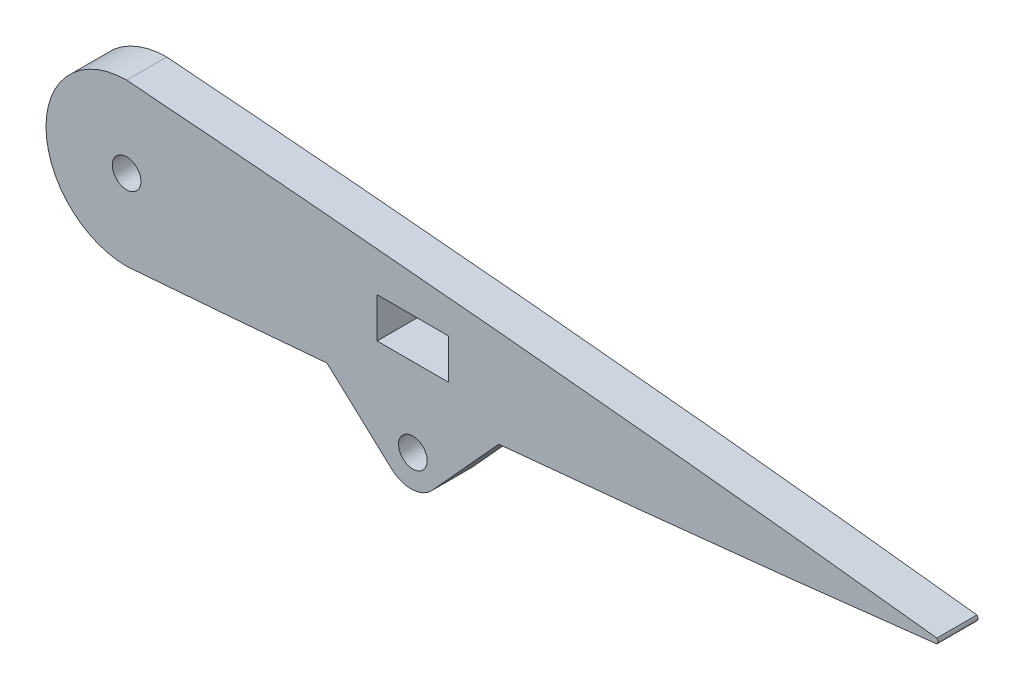
ISO-10303-21;
HEADER;
FILE_DESCRIPTION(('STEP AP214'),'2;1');
FILE_NAME('part.step','',(''),(''),'','','');
FILE_SCHEMA(('AUTOMOTIVE_DESIGN { 1 0 10303 214 1 1 1 1 }'));
ENDSEC;
DATA;
#1=APPLICATION_CONTEXT('core data for automotive mechanical design processes');
#2=APPLICATION_PROTOCOL_DEFINITION('international standard','automotive_design',2000,#1);
#3=PRODUCT_CONTEXT('',#1,'mechanical');
#4=PRODUCT('Part','Part','',(#3));
#5=PRODUCT_RELATED_PRODUCT_CATEGORY('part','',(#4));
#6=PRODUCT_DEFINITION_FORMATION('','',#4);
#7=PRODUCT_DEFINITION_CONTEXT('part definition',#1,'design');
#8=PRODUCT_DEFINITION('design','',#6,#7);
#9=PRODUCT_DEFINITION_SHAPE('','',#8);
#10=(LENGTH_UNIT() NAMED_UNIT(*) SI_UNIT(.MILLI.,.METRE.));
#11=(NAMED_UNIT(*) PLANE_ANGLE_UNIT() SI_UNIT($,.RADIAN.));
#12=(NAMED_UNIT(*) SI_UNIT($,.STERADIAN.) SOLID_ANGLE_UNIT());
#13=UNCERTAINTY_MEASURE_WITH_UNIT(LENGTH_MEASURE(1.E-05),#10,'distance_accuracy_value','');
#14=(GEOMETRIC_REPRESENTATION_CONTEXT(3) GLOBAL_UNCERTAINTY_ASSIGNED_CONTEXT((#13)) GLOBAL_UNIT_ASSIGNED_CONTEXT((#10,
#11,#12)) REPRESENTATION_CONTEXT('',''));
#15=CARTESIAN_POINT('',(0.,0.,0.));
#16=DIRECTION('',(0.,0.,1.));
#17=DIRECTION('',(1.,0.,0.));
#18=AXIS2_PLACEMENT_3D('',#15,#16,#17);
#19=CARTESIAN_POINT('',(138.229779125758,-125.665880118225,1.4));
#20=DIRECTION('',(-0.739933560222469,0.67267995841745,0.));
#21=DIRECTION('',(-0.67267995841745,-0.739933560222469,0.));
#22=AXIS2_PLACEMENT_3D('',#19,#20,#21);
#23=PLANE('',#22);
#24=DIRECTION('',(0.67267995841745,0.739933560222469,0.));
#25=VECTOR('',#24,1.);
#26=CARTESIAN_POINT('',(138.229779125758,-125.665880118225,-1.4));
#27=LINE('',#26,#25);
#28=CARTESIAN_POINT('',(244.735097220453,-8.51230921976116,-1.4));
#29=VERTEX_POINT('',#28);
#30=CARTESIAN_POINT('',(249.382624747265,-3.40012838827626,-1.4));
#31=VERTEX_POINT('',#30);
#32=EDGE_CURVE('E196',#29,#31,#27,.T.);
#33=ORIENTED_EDGE('',*,*,#32,.T.);
#34=DIRECTION('',(0.,0.,-1.));
#35=VECTOR('',#34,1.);
#36=CARTESIAN_POINT('',(249.382624747265,-3.40012838827626,1.4));
#37=LINE('',#36,#35);
#38=CARTESIAN_POINT('',(249.382624747265,-3.40012838827626,1.4));
#39=VERTEX_POINT('',#38);
#40=EDGE_CURVE('E11',#39,#31,#37,.T.);
#41=ORIENTED_EDGE('',*,*,#40,.F.);
#42=DIRECTION('',(0.67267995841745,0.739933560222469,0.));
#43=VECTOR('',#42,1.);
#44=CARTESIAN_POINT('',(138.229779125758,-125.665880118225,1.4));
#45=LINE('',#44,#43);
#46=CARTESIAN_POINT('',(244.735097220453,-8.51230921976116,1.4));
#47=VERTEX_POINT('',#46);
#48=EDGE_CURVE('E296',#47,#39,#45,.T.);
#49=ORIENTED_EDGE('',*,*,#48,.F.);
#50=DIRECTION('',(0.,0.,-1.));
#51=VECTOR('',#50,1.);
#52=CARTESIAN_POINT('',(244.735097220453,-8.51230921976116,1.4));
#53=LINE('',#52,#51);
#54=EDGE_CURVE('E236',#47,#29,#53,.T.);
#55=ORIENTED_EDGE('',*,*,#54,.T.);
#56=EDGE_LOOP('',(#33,#41,#49,#55));
#57=FACE_BOUND('',#56,.T.);
#58=ADVANCED_FACE('F41',(#57),#23,.F.);
#59=CARTESIAN_POINT('',(249.382624747265,-3.40012838827632,1.4));
#60=CARTESIAN_POINT('',(251.158571989076,-3.23227422422827,1.4));
#61=CARTESIAN_POINT('',(254.371192488481,-2.92300016112608,1.4));
#62=CARTESIAN_POINT('',(258.952644661841,-2.46718813767968,1.4));
#63=CARTESIAN_POINT('',(263.04774337821,-2.04785660382374,1.4));
#64=CARTESIAN_POINT('',(266.898988861822,-1.64260730408502,1.4));
#65=CARTESIAN_POINT('',(270.455833183166,-1.25859090465163,1.4));
#66=CARTESIAN_POINT('',(273.651166983566,-0.905304265448741,1.4));
#67=CARTESIAN_POINT('',(276.385426802208,-0.596436481930152,1.4));
#68=CARTESIAN_POINT('',(278.452596210233,-0.358958360841393,1.4));
#69=CARTESIAN_POINT('',(279.592043703671,-0.226075897782657,1.4));
#70=CARTESIAN_POINT('',(280.,-0.1785,1.4));
#71=B_SPLINE_CURVE_WITH_KNOTS('',3,(#59,#60,#61,#62,#63,#64,#65,#66,#67,#68,#69,#70),
.UNSPECIFIED.,.F.,.F.,(4,1,1,1,1,1,1,1,1,4),(0.821480843588143,0.852512114582347,
0.877624445997917,0.901571133904992,0.924121062493777,0.944988816236938,0.963803938777258,
0.980044339265455,0.992855276358985,1.),.UNSPECIFIED.);
#72=DIRECTION('',(0.,0.,-1.));
#73=VECTOR('',#72,1.);
#74=SURFACE_OF_LINEAR_EXTRUSION('',#71,#73);
#75=CARTESIAN_POINT('',(249.382624747265,-3.40012838827632,-1.4));
#76=CARTESIAN_POINT('',(251.158571989076,-3.23227422422827,-1.4));
#77=CARTESIAN_POINT('',(254.371192488481,-2.92300016112608,-1.4));
#78=CARTESIAN_POINT('',(258.952644661841,-2.46718813767968,-1.4));
#79=CARTESIAN_POINT('',(263.04774337821,-2.04785660382374,-1.4));
#80=CARTESIAN_POINT('',(266.898988861822,-1.64260730408502,-1.4));
#81=CARTESIAN_POINT('',(270.455833183166,-1.25859090465163,-1.4));
#82=CARTESIAN_POINT('',(273.651166983566,-0.905304265448741,-1.4));
#83=CARTESIAN_POINT('',(276.385426802208,-0.596436481930152,-1.4));
#84=CARTESIAN_POINT('',(278.452596210233,-0.358958360841393,-1.4));
#85=CARTESIAN_POINT('',(279.592043703671,-0.226075897782657,-1.4));
#86=CARTESIAN_POINT('',(280.,-0.1785,-1.4));
#87=B_SPLINE_CURVE_WITH_KNOTS('',3,(#75,#76,#77,#78,#79,#80,#81,#82,#83,#84,#85,#86),
.UNSPECIFIED.,.F.,.F.,(4,1,1,1,1,1,1,1,1,4),(0.821480843588143,0.852512114582347,
0.877624445997917,0.901571133904992,0.924121062493777,0.944988816236938,0.963803938777258,
0.980044339265455,0.992855276358985,1.),.UNSPECIFIED.);
#88=CARTESIAN_POINT('',(280.,-0.1785,-1.4));
#89=VERTEX_POINT('',#88);
#90=EDGE_CURVE('E200',#31,#89,#87,.T.);
#91=ORIENTED_EDGE('',*,*,#90,.T.);
#92=DIRECTION('',(0.,0.,-1.));
#93=VECTOR('',#92,1.);
#94=CARTESIAN_POINT('',(280.,-0.1785,1.4));
#95=LINE('',#94,#93);
#96=CARTESIAN_POINT('',(280.,-0.1785,1.4));
#97=VERTEX_POINT('',#96);
#98=EDGE_CURVE('E52',#97,#89,#95,.T.);
#99=ORIENTED_EDGE('',*,*,#98,.F.);
#100=EDGE_CURVE('E299',#39,#97,#71,.T.);
#101=ORIENTED_EDGE('',*,*,#100,.F.);
#102=ORIENTED_EDGE('',*,*,#40,.T.);
#103=EDGE_LOOP('',(#91,#99,#101,#102));
#104=FACE_BOUND('',#103,.T.);
#105=ADVANCED_FACE('F311',(#104),#74,.F.);
#106=CARTESIAN_POINT('',(279.8215,0.,1.4));
#107=DIRECTION('',(0.,0.,-1.));
#108=DIRECTION('',(-1.,0.,0.));
#109=AXIS2_PLACEMENT_3D('',#106,#107,#108);
#110=CYLINDRICAL_SURFACE('',#109,0.252437120883675);
#111=CARTESIAN_POINT('',(279.8215,0.,-1.4));
#112=DIRECTION('',(0.,0.,1.));
#113=DIRECTION('',(1.,0.,0.));
#114=AXIS2_PLACEMENT_3D('',#111,#112,#113);
#115=CIRCLE('',#114,0.252437120883675);
#116=CARTESIAN_POINT('',(280.,0.1785,-1.4));
#117=VERTEX_POINT('',#116);
#118=EDGE_CURVE('E206',#117,#89,#115,.F.);
#119=ORIENTED_EDGE('',*,*,#118,.F.);
#120=DIRECTION('',(0.,0.,-1.));
#121=VECTOR('',#120,1.);
#122=CARTESIAN_POINT('',(280.,0.1785,1.4));
#123=LINE('',#122,#121);
#124=CARTESIAN_POINT('',(280.,0.1785,1.4));
#125=VERTEX_POINT('',#124);
#126=EDGE_CURVE('E247',#125,#117,#123,.T.);
#127=ORIENTED_EDGE('',*,*,#126,.F.);
#128=CARTESIAN_POINT('',(279.8215,0.,1.4));
#129=DIRECTION('',(0.,0.,1.));
#130=DIRECTION('',(1.,0.,0.));
#131=AXIS2_PLACEMENT_3D('',#128,#129,#130);
#132=CIRCLE('',#131,0.252437120883675);
#133=EDGE_CURVE('E305',#125,#97,#132,.F.);
#134=ORIENTED_EDGE('',*,*,#133,.T.);
#135=ORIENTED_EDGE('',*,*,#98,.T.);
#136=EDGE_LOOP('',(#119,#127,#134,#135));
#137=FACE_BOUND('',#136,.T.);
#138=ADVANCED_FACE('F315',(#137),#110,.T.);
#139=CARTESIAN_POINT('',(280.,0.1785,1.4));
#140=CARTESIAN_POINT('',(279.592043703671,0.226075897783467,1.4));
#141=CARTESIAN_POINT('',(278.452596210234,0.358958360844463,1.4));
#142=CARTESIAN_POINT('',(276.385426802208,0.596436481937331,1.4));
#143=CARTESIAN_POINT('',(273.651166983567,0.905304265461348,1.4));
#144=CARTESIAN_POINT('',(270.455833183168,1.25859090467058,1.4));
#145=CARTESIAN_POINT('',(266.898988861825,1.64260730411104,1.4));
#146=CARTESIAN_POINT('',(263.047743378214,2.04785660385741,1.4));
#147=CARTESIAN_POINT('',(258.952644661846,2.46718813772148,1.4));
#148=CARTESIAN_POINT('',(253.11611192075,3.04786904369115,1.4));
#149=CARTESIAN_POINT('',(247.071089235748,3.62220530992837,1.4));
#150=CARTESIAN_POINT('',(240.854179313273,4.18491264898859,1.4));
#151=CARTESIAN_POINT('',(236.038226964104,4.60581174883637,1.4));
#152=CARTESIAN_POINT('',(231.150377302514,5.0173511026198,1.4));
#153=CARTESIAN_POINT('',(226.209311113549,5.41695826474113,1.4));
#154=CARTESIAN_POINT('',(221.232257466585,5.802244474926,1.4));
#155=CARTESIAN_POINT('',(216.235178286272,6.17086457697306,1.4));
#156=CARTESIAN_POINT('',(211.232977593233,6.52047434958791,1.4));
#157=CARTESIAN_POINT('',(206.239642946259,6.84887299963153,1.4));
#158=CARTESIAN_POINT('',(201.268368916985,7.15382688632495,1.4));
#159=CARTESIAN_POINT('',(196.331634567492,7.43310533690328,1.4));
#160=CARTESIAN_POINT('',(191.441311474098,7.68460443906704,1.4));
#161=CARTESIAN_POINT('',(186.608700126931,7.90621829286941,1.4));
#162=CARTESIAN_POINT('',(181.844626933159,8.09595849303594,1.4));
#163=CARTESIAN_POINT('',(177.159453511195,8.25195768192942,1.4));
#164=CARTESIAN_POINT('',(172.563150271755,8.37248656398387,1.4));
#165=CARTESIAN_POINT('',(168.065295924147,8.45595366245417,1.4));
#166=CARTESIAN_POINT('',(163.675147454163,8.5010026998616,1.4));
#167=CARTESIAN_POINT('',(159.401643403725,8.50652296727326,1.4));
#168=CARTESIAN_POINT('',(155.253439755899,8.47152880790102,1.4));
#169=CARTESIAN_POINT('',(151.238917925322,8.39550607585732,1.4));
#170=CARTESIAN_POINT('',(147.366223919106,8.27798597685019,1.4));
#171=CARTESIAN_POINT('',(143.643266298458,8.11897556141504,1.4));
#172=CARTESIAN_POINT('',(140.077743555427,7.91867894287145,1.4));
#173=CARTESIAN_POINT('',(136.677139412155,7.67760454203032,1.4));
#174=CARTESIAN_POINT('',(133.44876289533,7.39648056861162,1.4));
#175=CARTESIAN_POINT('',(130.399721685833,7.07642431038863,1.4));
#176=CARTESIAN_POINT('',(127.536961088608,6.71865034112428,1.4));
#177=CARTESIAN_POINT('',(124.867245825052,6.32466607739586,1.4));
#178=CARTESIAN_POINT('',(122.397158973637,5.89612056643678,1.4));
#179=CARTESIAN_POINT('',(120.133109351335,5.43479747619412,1.4));
#180=CARTESIAN_POINT('',(118.081312132678,4.94256764101073,1.4));
#181=CARTESIAN_POINT('',(116.247665797811,4.42139238611828,1.4));
#182=CARTESIAN_POINT('',(114.637939719778,3.87306046577258,1.4));
#183=CARTESIAN_POINT('',(113.256788366372,3.29930923783808,1.4));
#184=CARTESIAN_POINT('',(112.109835923497,2.70130638754162,1.4));
#185=CARTESIAN_POINT('',(111.196336340545,2.07855523302877,1.4));
#186=CARTESIAN_POINT('',(110.530223641577,1.42706975809109,1.4));
#187=CARTESIAN_POINT('',(110.085538217979,0.734230220465984,1.4));
#188=CARTESIAN_POINT('',(110.027578175867,0.236721440142773,1.4));
#189=CARTESIAN_POINT('',(110.,0.,1.4));
#190=B_SPLINE_CURVE_WITH_KNOTS('',3,(#139,#140,#141,#142,#143,#144,#145,#146,#147,#148,#149,
#150,#151,#152,#153,#154,#155,#156,#157,#158,#159,#160,#161,#162,#163,#164,#165,#166,#167,#168,
#169,#170,#171,#172,#173,#174,#175,#176,#177,#178,#179,#180,#181,#182,#183,#184,#185,#186,#187,
#188,#189),.UNSPECIFIED.,.F.,.F.,(4,1,1,1,1,1,1,1,1,1,1,1,1,1,1,1,1,1,1,1,1,1,1,1,1,1,1,1,1,1,1,
1,1,1,1,1,1,1,1,1,1,1,1,1,1,1,1,1,4),(0.,0.00714472364101537,0.0199556607345446,
0.0361960612227423,0.0550111837630616,0.0758789375062231,0.0984288660950085,0.122375554002083,
0.147487885417653,0.200459747132314,0.228005170188377,0.256076453638138,0.284555151070125,
0.31333276259982,0.342309553949656,0.371392651251454,0.400495752426115,0.429537687145242,
0.458441905920554,0.487136113386761,0.515551917136779,0.543623846405843,0.571289984327897,
0.598490809568145,0.625169613225281,0.651272029103837,0.676746157949116,0.701541790883913,
0.725611016556625,0.74890783507394,0.771387785068823,0.793008138575143,0.813728032856974,
0.833507815357633,0.852309696093785,0.870097310144046,0.886835918069106,0.902492781713446,
0.917037139140432,0.930441053860646,0.942679762162792,0.953733567025024,0.963589785484808,
0.97224701929817,0.979722225388436,0.986065145275041,0.991385258303778,0.995900988803729,1.),.UNSPECIFIED.);
#191=DIRECTION('',(0.,0.,-1.));
#192=VECTOR('',#191,1.);
#193=SURFACE_OF_LINEAR_EXTRUSION('',#190,#192);
#194=CARTESIAN_POINT('',(280.,0.1785,-1.4));
#195=CARTESIAN_POINT('',(279.592043703671,0.226075897783467,-1.4));
#196=CARTESIAN_POINT('',(278.452596210234,0.358958360844463,-1.4));
#197=CARTESIAN_POINT('',(276.385426802208,0.596436481937331,-1.4));
#198=CARTESIAN_POINT('',(273.651166983567,0.905304265461348,-1.4));
#199=CARTESIAN_POINT('',(270.455833183168,1.25859090467058,-1.4));
#200=CARTESIAN_POINT('',(266.898988861825,1.64260730411104,-1.4));
#201=CARTESIAN_POINT('',(263.047743378214,2.04785660385741,-1.4));
#202=CARTESIAN_POINT('',(258.952644661846,2.46718813772148,-1.4));
#203=CARTESIAN_POINT('',(253.11611192075,3.04786904369115,-1.4));
#204=CARTESIAN_POINT('',(247.071089235748,3.62220530992837,-1.4));
#205=CARTESIAN_POINT('',(240.854179313273,4.18491264898859,-1.4));
#206=CARTESIAN_POINT('',(236.038226964104,4.60581174883637,-1.4));
#207=CARTESIAN_POINT('',(231.150377302514,5.0173511026198,-1.4));
#208=CARTESIAN_POINT('',(226.209311113549,5.41695826474113,-1.4));
#209=CARTESIAN_POINT('',(221.232257466585,5.802244474926,-1.4));
#210=CARTESIAN_POINT('',(216.235178286272,6.17086457697306,-1.4));
#211=CARTESIAN_POINT('',(211.232977593233,6.52047434958791,-1.4));
#212=CARTESIAN_POINT('',(206.239642946259,6.84887299963153,-1.4));
#213=CARTESIAN_POINT('',(201.268368916985,7.15382688632495,-1.4));
#214=CARTESIAN_POINT('',(196.331634567492,7.43310533690328,-1.4));
#215=CARTESIAN_POINT('',(191.441311474098,7.68460443906704,-1.4));
#216=CARTESIAN_POINT('',(186.608700126931,7.90621829286941,-1.4));
#217=CARTESIAN_POINT('',(181.844626933159,8.09595849303594,-1.4));
#218=CARTESIAN_POINT('',(177.159453511195,8.25195768192942,-1.4));
#219=CARTESIAN_POINT('',(172.563150271755,8.37248656398387,-1.4));
#220=CARTESIAN_POINT('',(168.065295924147,8.45595366245417,-1.4));
#221=CARTESIAN_POINT('',(163.675147454163,8.5010026998616,-1.4));
#222=CARTESIAN_POINT('',(159.401643403725,8.50652296727326,-1.4));
#223=CARTESIAN_POINT('',(155.253439755899,8.47152880790102,-1.4));
#224=CARTESIAN_POINT('',(151.238917925322,8.39550607585732,-1.4));
#225=CARTESIAN_POINT('',(147.366223919106,8.27798597685019,-1.4));
#226=CARTESIAN_POINT('',(143.643266298458,8.11897556141504,-1.4));
#227=CARTESIAN_POINT('',(140.077743555427,7.91867894287145,-1.4));
#228=CARTESIAN_POINT('',(136.677139412155,7.67760454203032,-1.4));
#229=CARTESIAN_POINT('',(133.44876289533,7.39648056861162,-1.4));
#230=CARTESIAN_POINT('',(130.399721685833,7.07642431038863,-1.4));
#231=CARTESIAN_POINT('',(127.536961088608,6.71865034112428,-1.4));
#232=CARTESIAN_POINT('',(124.867245825052,6.32466607739586,-1.4));
#233=CARTESIAN_POINT('',(122.397158973637,5.89612056643678,-1.4));
#234=CARTESIAN_POINT('',(120.133109351335,5.43479747619412,-1.4));
#235=CARTESIAN_POINT('',(118.081312132678,4.94256764101073,-1.4));
#236=CARTESIAN_POINT('',(116.247665797811,4.42139238611828,-1.4));
#237=CARTESIAN_POINT('',(114.637939719778,3.87306046577258,-1.4));
#238=CARTESIAN_POINT('',(113.256788366372,3.29930923783808,-1.4));
#239=CARTESIAN_POINT('',(112.109835923497,2.70130638754162,-1.4));
#240=CARTESIAN_POINT('',(111.196336340545,2.07855523302877,-1.4));
#241=CARTESIAN_POINT('',(110.530223641577,1.42706975809109,-1.4));
#242=CARTESIAN_POINT('',(110.085538217979,0.734230220465984,-1.4));
#243=CARTESIAN_POINT('',(110.027578175867,0.236721440142773,-1.4));
#244=CARTESIAN_POINT('',(110.,0.,-1.4));
#245=B_SPLINE_CURVE_WITH_KNOTS('',3,(#194,#195,#196,#197,#198,#199,#200,#201,#202,#203,#204,
#205,#206,#207,#208,#209,#210,#211,#212,#213,#214,#215,#216,#217,#218,#219,#220,#221,#222,#223,
#224,#225,#226,#227,#228,#229,#230,#231,#232,#233,#234,#235,#236,#237,#238,#239,#240,#241,#242,
#243,#244),.UNSPECIFIED.,.F.,.F.,(4,1,1,1,1,1,1,1,1,1,1,1,1,1,1,1,1,1,1,1,1,1,1,1,1,1,1,1,1,1,1,
1,1,1,1,1,1,1,1,1,1,1,1,1,1,1,1,1,4),(0.,0.00714472364101537,0.0199556607345446,
0.0361960612227423,0.0550111837630616,0.0758789375062231,0.0984288660950085,0.122375554002083,
0.147487885417653,0.200459747132314,0.228005170188377,0.256076453638138,0.284555151070125,
0.31333276259982,0.342309553949656,0.371392651251454,0.400495752426115,0.429537687145242,
0.458441905920554,0.487136113386761,0.515551917136779,0.543623846405843,0.571289984327897,
0.598490809568145,0.625169613225281,0.651272029103837,0.676746157949116,0.701541790883913,
0.725611016556625,0.74890783507394,0.771387785068823,0.793008138575143,0.813728032856974,
0.833507815357633,0.852309696093785,0.870097310144046,0.886835918069106,0.902492781713446,
0.917037139140432,0.930441053860646,0.942679762162792,0.953733567025024,0.963589785484808,
0.97224701929817,0.979722225388436,0.986065145275041,0.991385258303778,0.995900988803729,1.),.UNSPECIFIED.);
#246=CARTESIAN_POINT('',(223.382624747256,5.63499062833055,-1.4));
#247=VERTEX_POINT('',#246);
#248=EDGE_CURVE('E213',#117,#247,#245,.T.);
#249=ORIENTED_EDGE('',*,*,#248,.T.);
#250=DIRECTION('',(0.,0.,-1.));
#251=VECTOR('',#250,1.);
#252=CARTESIAN_POINT('',(223.382624747256,5.63499062833055,1.4));
#253=LINE('',#252,#251);
#254=CARTESIAN_POINT('',(223.382624747256,5.63499062833055,1.4));
#255=VERTEX_POINT('',#254);
#256=EDGE_CURVE('E243',#255,#247,#253,.T.);
#257=ORIENTED_EDGE('',*,*,#256,.F.);
#258=EDGE_CURVE('E354',#125,#255,#190,.T.);
#259=ORIENTED_EDGE('',*,*,#258,.F.);
#260=ORIENTED_EDGE('',*,*,#126,.T.);
#261=EDGE_LOOP('',(#249,#257,#259,#260));
#262=FACE_BOUND('',#261,.T.);
#263=ADVANCED_FACE('F350',(#262),#193,.F.);
#264=CARTESIAN_POINT('',(223.382624747265,3.73832909072992E-12,1.4));
#265=DIRECTION('',(0.,0.,-1.));
#266=DIRECTION('',(-1.,0.,0.));
#267=AXIS2_PLACEMENT_3D('',#264,#265,#266);
#268=CYLINDRICAL_SURFACE('',#267,5.63499062832681);
#269=CARTESIAN_POINT('',(223.382624747265,3.73832909072992E-12,-1.4));
#270=DIRECTION('',(0.,0.,1.));
#271=DIRECTION('',(1.,0.,0.));
#272=AXIS2_PLACEMENT_3D('',#269,#270,#271);
#273=CIRCLE('',#272,5.63499062832681);
#274=CARTESIAN_POINT('',(223.382624747256,-5.63499062832307,-1.4));
#275=VERTEX_POINT('',#274);
#276=EDGE_CURVE('E218',#247,#275,#273,.T.);
#277=ORIENTED_EDGE('',*,*,#276,.T.);
#278=DIRECTION('',(0.,0.,-1.));
#279=VECTOR('',#278,1.);
#280=CARTESIAN_POINT('',(223.382624747256,-5.63499062832307,1.4));
#281=LINE('',#280,#279);
#282=CARTESIAN_POINT('',(223.382624747256,-5.63499062832307,1.4));
#283=VERTEX_POINT('',#282);
#284=EDGE_CURVE('E159',#283,#275,#281,.T.);
#285=ORIENTED_EDGE('',*,*,#284,.F.);
#286=CARTESIAN_POINT('',(223.382624747265,3.73832909072992E-12,1.4));
#287=DIRECTION('',(0.,0.,1.));
#288=DIRECTION('',(1.,0.,0.));
#289=AXIS2_PLACEMENT_3D('',#286,#287,#288);
#290=CIRCLE('',#289,5.63499062832681);
#291=EDGE_CURVE('E148',#255,#283,#290,.T.);
#292=ORIENTED_EDGE('',*,*,#291,.F.);
#293=ORIENTED_EDGE('',*,*,#256,.T.);
#294=EDGE_LOOP('',(#277,#285,#292,#293));
#295=FACE_BOUND('',#294,.T.);
#296=ADVANCED_FACE('F344',(#295),#268,.T.);
#297=CARTESIAN_POINT('',(110.,0.,1.4));
#298=CARTESIAN_POINT('',(110.0275781759,-0.23672144013897,1.4));
#299=CARTESIAN_POINT('',(110.08553821808,-0.734230220454186,1.4));
#300=CARTESIAN_POINT('',(110.530223641774,-1.42706975801802,1.4));
#301=CARTESIAN_POINT('',(111.196336340831,-2.07855523286391,1.4));
#302=CARTESIAN_POINT('',(112.109835923869,-2.70130638725085,1.4));
#303=CARTESIAN_POINT('',(113.256788366826,-3.29930923738926,1.4));
#304=CARTESIAN_POINT('',(114.637939720312,-3.87306046513341,1.4));
#305=CARTESIAN_POINT('',(116.24766579842,-4.42139238525728,1.4));
#306=CARTESIAN_POINT('',(118.081312133359,-4.94256763989703,1.4));
#307=CARTESIAN_POINT('',(120.133109352084,-5.43479747479766,1.4));
#308=CARTESIAN_POINT('',(122.39715897445,-5.8961205647283,1.4));
#309=CARTESIAN_POINT('',(124.867245825924,-6.32466607534698,1.4));
#310=CARTESIAN_POINT('',(127.536961089533,-6.71865033870748,1.4));
#311=CARTESIAN_POINT('',(130.399721686808,-7.07642430757731,1.4));
#312=CARTESIAN_POINT('',(133.44876289635,-7.3964805653801,1.4));
#313=CARTESIAN_POINT('',(136.677139413213,-7.6776045383539,1.4));
#314=CARTESIAN_POINT('',(140.077743556518,-7.91867893872639,1.4));
#315=CARTESIAN_POINT('',(143.643266299577,-8.1189755567786,1.4));
#316=CARTESIAN_POINT('',(147.366223920246,-8.27798597170068,1.4));
#317=CARTESIAN_POINT('',(151.238917926479,-8.39550607017411,1.4));
#318=CARTESIAN_POINT('',(155.253439757066,-8.47152880166456,1.4));
#319=CARTESIAN_POINT('',(159.401643404897,-8.50652296046512,1.4));
#320=CARTESIAN_POINT('',(163.675147455335,-8.50100269246453,1.4));
#321=CARTESIAN_POINT('',(168.065295925312,-8.45595365445208,1.4));
#322=CARTESIAN_POINT('',(172.563150272909,-8.37248655536192,1.4));
#323=CARTESIAN_POINT('',(177.159453512332,-8.25195767267405,1.4));
#324=CARTESIAN_POINT('',(181.844626934275,-8.0959584831349,1.4));
#325=CARTESIAN_POINT('',(186.60870012802,-7.90621828231182,1.4));
#326=CARTESIAN_POINT('',(191.441311475157,-7.68460442784347,1.4));
#327=CARTESIAN_POINT('',(196.331634568517,-7.43310532500576,1.4));
#328=CARTESIAN_POINT('',(201.268368917971,-7.15382687374709,1.4));
#329=CARTESIAN_POINT('',(206.239642947203,-6.84887298636857,1.4));
#330=CARTESIAN_POINT('',(211.232977594131,-6.52047433563681,1.4));
#331=CARTESIAN_POINT('',(216.235178287122,-6.17086456233259,1.4));
#332=CARTESIAN_POINT('',(221.232257467384,-5.80224445959688,1.4));
#333=CARTESIAN_POINT('',(226.209311114295,-5.41695824872611,1.4));
#334=CARTESIAN_POINT('',(231.150377303206,-5.01735108592385,1.4));
#335=CARTESIAN_POINT('',(234.870714804015,-4.70411205455705,1.4));
#336=CARTESIAN_POINT('',(236.942213239561,-4.52545946281774,1.4));
#337=CARTESIAN_POINT('',(237.382624747265,-4.48728584819188,1.4));
#338=B_SPLINE_CURVE_WITH_KNOTS('',3,(#297,#298,#299,#300,#301,#302,#303,#304,#305,#306,#307,
#308,#309,#310,#311,#312,#313,#314,#315,#316,#317,#318,#319,#320,#321,#322,#323,#324,#325,#326,
#327,#328,#329,#330,#331,#332,#333,#334,#335,#336,#337),.UNSPECIFIED.,.F.,.F.,(4,1,1,1,1,1,1,1,
1,1,1,1,1,1,1,1,1,1,1,1,1,1,1,1,1,1,1,1,1,1,1,1,1,1,1,1,1,1,4),(0.,0.00409901119627066,
0.00861474169622249,0.013934854724959,0.0202777746115639,0.0277529807018305,0.0364102145151919,
0.0462664329749759,0.057320237837208,0.0695589461393541,0.0829628608595683,0.0975072182865541,
0.113164081930894,0.129902689855954,0.147690303906216,0.166492184642367,0.186271967143026,
0.206991861424858,0.228612214931177,0.25109216492606,0.274388983443375,0.298458209116087,
0.323253842050884,0.348727970896163,0.374830386774719,0.401509190431855,0.428710015672103,
0.456376153594157,0.484448082863221,0.512863886613239,0.541558094079446,0.570462312854758,
0.599504247573885,0.628607348748546,0.657690446050344,0.68666723740018,0.715444848929875,
0.743923546361862,0.751613474270005),.UNSPECIFIED.);
#339=DIRECTION('',(0.,0.,-1.));
#340=VECTOR('',#339,1.);
#341=SURFACE_OF_LINEAR_EXTRUSION('',#338,#340);
#342=CARTESIAN_POINT('',(110.,0.,-1.4));
#343=CARTESIAN_POINT('',(110.0275781759,-0.23672144013897,-1.4));
#344=CARTESIAN_POINT('',(110.08553821808,-0.734230220454186,-1.4));
#345=CARTESIAN_POINT('',(110.530223641774,-1.42706975801802,-1.4));
#346=CARTESIAN_POINT('',(111.196336340831,-2.07855523286391,-1.4));
#347=CARTESIAN_POINT('',(112.109835923869,-2.70130638725085,-1.4));
#348=CARTESIAN_POINT('',(113.256788366826,-3.29930923738926,-1.4));
#349=CARTESIAN_POINT('',(114.637939720312,-3.87306046513341,-1.4));
#350=CARTESIAN_POINT('',(116.24766579842,-4.42139238525728,-1.4));
#351=CARTESIAN_POINT('',(118.081312133359,-4.94256763989703,-1.4));
#352=CARTESIAN_POINT('',(120.133109352084,-5.43479747479766,-1.4));
#353=CARTESIAN_POINT('',(122.39715897445,-5.8961205647283,-1.4));
#354=CARTESIAN_POINT('',(124.867245825924,-6.32466607534698,-1.4));
#355=CARTESIAN_POINT('',(127.536961089533,-6.71865033870748,-1.4));
#356=CARTESIAN_POINT('',(130.399721686808,-7.07642430757731,-1.4));
#357=CARTESIAN_POINT('',(133.44876289635,-7.3964805653801,-1.4));
#358=CARTESIAN_POINT('',(136.677139413213,-7.6776045383539,-1.4));
#359=CARTESIAN_POINT('',(140.077743556518,-7.91867893872639,-1.4));
#360=CARTESIAN_POINT('',(143.643266299577,-8.1189755567786,-1.4));
#361=CARTESIAN_POINT('',(147.366223920246,-8.27798597170068,-1.4));
#362=CARTESIAN_POINT('',(151.238917926479,-8.39550607017411,-1.4));
#363=CARTESIAN_POINT('',(155.253439757066,-8.47152880166456,-1.4));
#364=CARTESIAN_POINT('',(159.401643404897,-8.50652296046512,-1.4));
#365=CARTESIAN_POINT('',(163.675147455335,-8.50100269246453,-1.4));
#366=CARTESIAN_POINT('',(168.065295925312,-8.45595365445208,-1.4));
#367=CARTESIAN_POINT('',(172.563150272909,-8.37248655536192,-1.4));
#368=CARTESIAN_POINT('',(177.159453512332,-8.25195767267405,-1.4));
#369=CARTESIAN_POINT('',(181.844626934275,-8.0959584831349,-1.4));
#370=CARTESIAN_POINT('',(186.60870012802,-7.90621828231182,-1.4));
#371=CARTESIAN_POINT('',(191.441311475157,-7.68460442784347,-1.4));
#372=CARTESIAN_POINT('',(196.331634568517,-7.43310532500576,-1.4));
#373=CARTESIAN_POINT('',(201.268368917971,-7.15382687374709,-1.4));
#374=CARTESIAN_POINT('',(206.239642947203,-6.84887298636857,-1.4));
#375=CARTESIAN_POINT('',(211.232977594131,-6.52047433563681,-1.4));
#376=CARTESIAN_POINT('',(216.235178287122,-6.17086456233259,-1.4));
#377=CARTESIAN_POINT('',(221.232257467384,-5.80224445959688,-1.4));
#378=CARTESIAN_POINT('',(226.209311114295,-5.41695824872611,-1.4));
#379=CARTESIAN_POINT('',(231.150377303206,-5.01735108592385,-1.4));
#380=CARTESIAN_POINT('',(234.870714804015,-4.70411205455705,-1.4));
#381=CARTESIAN_POINT('',(236.942213239561,-4.52545946281774,-1.4));
#382=CARTESIAN_POINT('',(237.382624747265,-4.48728584819188,-1.4));
#383=B_SPLINE_CURVE_WITH_KNOTS('',3,(#342,#343,#344,#345,#346,#347,#348,#349,#350,#351,#352,
#353,#354,#355,#356,#357,#358,#359,#360,#361,#362,#363,#364,#365,#366,#367,#368,#369,#370,#371,
#372,#373,#374,#375,#376,#377,#378,#379,#380,#381,#382),.UNSPECIFIED.,.F.,.F.,(4,1,1,1,1,1,1,1,
1,1,1,1,1,1,1,1,1,1,1,1,1,1,1,1,1,1,1,1,1,1,1,1,1,1,1,1,1,1,4),(0.,0.00409901119627066,
0.00861474169622249,0.013934854724959,0.0202777746115639,0.0277529807018305,0.0364102145151919,
0.0462664329749759,0.057320237837208,0.0695589461393541,0.0829628608595683,0.0975072182865541,
0.113164081930894,0.129902689855954,0.147690303906216,0.166492184642367,0.186271967143026,
0.206991861424858,0.228612214931177,0.25109216492606,0.274388983443375,0.298458209116087,
0.323253842050884,0.348727970896163,0.374830386774719,0.401509190431855,0.428710015672103,
0.456376153594157,0.484448082863221,0.512863886613239,0.541558094079446,0.570462312854758,
0.599504247573885,0.628607348748546,0.657690446050344,0.68666723740018,0.715444848929875,
0.743923546361862,0.751613474270005),.UNSPECIFIED.);
#384=CARTESIAN_POINT('',(237.382624747265,-4.48728584819189,-1.4));
#385=VERTEX_POINT('',#384);
#386=EDGE_CURVE('E157',#275,#385,#383,.T.);
#387=ORIENTED_EDGE('',*,*,#386,.T.);
#388=DIRECTION('',(0.,0.,-1.));
#389=VECTOR('',#388,1.);
#390=CARTESIAN_POINT('',(237.382624747265,-4.48728584819189,1.4));
#391=LINE('',#390,#389);
#392=CARTESIAN_POINT('',(237.382624747265,-4.48728584819189,1.4));
#393=VERTEX_POINT('',#392);
#394=EDGE_CURVE('E154',#393,#385,#391,.T.);
#395=ORIENTED_EDGE('',*,*,#394,.F.);
#396=EDGE_CURVE('E142',#283,#393,#338,.T.);
#397=ORIENTED_EDGE('',*,*,#396,.F.);
#398=ORIENTED_EDGE('',*,*,#284,.T.);
#399=EDGE_LOOP('',(#387,#395,#397,#398));
#400=FACE_BOUND('',#399,.T.);
#401=ADVANCED_FACE('F155',(#400),#341,.F.);
#402=CARTESIAN_POINT('',(106.426231194206,115.833574820091,1.4));
#403=DIRECTION('',(0.676572097084633,0.736376396584316,0.));
#404=DIRECTION('',(-0.736376396584316,0.676572097084633,0.));
#405=AXIS2_PLACEMENT_3D('',#402,#403,#404);
#406=PLANE('',#405);
#407=DIRECTION('',(0.736376396584316,-0.676572097084633,0.));
#408=VECTOR('',#407,1.);
#409=CARTESIAN_POINT('',(106.426231194206,115.833574820091,-1.4));
#410=LINE('',#409,#408);
#411=CARTESIAN_POINT('',(241.902085905839,-8.63970209609492,-1.4));
#412=VERTEX_POINT('',#411);
#413=EDGE_CURVE('E102',#385,#412,#410,.T.);
#414=ORIENTED_EDGE('',*,*,#413,.T.);
#415=DIRECTION('',(0.,0.,-1.));
#416=VECTOR('',#415,1.);
#417=CARTESIAN_POINT('',(241.902085905839,-8.63970209609492,1.4));
#418=LINE('',#417,#416);
#419=CARTESIAN_POINT('',(241.902085905839,-8.63970209609492,1.4));
#420=VERTEX_POINT('',#419);
#421=EDGE_CURVE('E160',#420,#412,#418,.T.);
#422=ORIENTED_EDGE('',*,*,#421,.F.);
#423=DIRECTION('',(0.736376396584316,-0.676572097084633,0.));
#424=VECTOR('',#423,1.);
#425=CARTESIAN_POINT('',(106.426231194206,115.833574820091,1.4));
#426=LINE('',#425,#424);
#427=EDGE_CURVE('E146',#393,#420,#426,.T.);
#428=ORIENTED_EDGE('',*,*,#427,.F.);
#429=ORIENTED_EDGE('',*,*,#394,.T.);
#430=EDGE_LOOP('',(#414,#422,#428,#429));
#431=FACE_BOUND('',#430,.T.);
#432=ADVANCED_FACE('F162',(#431),#406,.F.);
#433=CARTESIAN_POINT('',(245.882624747265,0.,1.4));
#434=DIRECTION('',(-1.,0.,0.));
#435=DIRECTION('',(0.,0.,1.));
#436=AXIS2_PLACEMENT_3D('',#433,#434,#435);
#437=PLANE('',#436);
#438=DIRECTION('',(0.,1.,0.));
#439=VECTOR('',#438,1.);
#440=CARTESIAN_POINT('',(245.882624747265,0.,-1.4));
#441=LINE('',#440,#439);
#442=CARTESIAN_POINT('',(245.882624747265,-1.4,-1.4));
#443=VERTEX_POINT('',#442);
#444=CARTESIAN_POINT('',(245.882624747265,1.4,-1.4));
#445=VERTEX_POINT('',#444);
#446=EDGE_CURVE('E173',#443,#445,#441,.T.);
#447=ORIENTED_EDGE('',*,*,#446,.F.);
#448=DIRECTION('',(0.,0.,-1.));
#449=VECTOR('',#448,1.);
#450=CARTESIAN_POINT('',(245.882624747265,-1.4,1.4));
#451=LINE('',#450,#449);
#452=CARTESIAN_POINT('',(245.882624747265,-1.4,1.4));
#453=VERTEX_POINT('',#452);
#454=EDGE_CURVE('E45',#453,#443,#451,.T.);
#455=ORIENTED_EDGE('',*,*,#454,.F.);
#456=DIRECTION('',(0.,1.,0.));
#457=VECTOR('',#456,1.);
#458=CARTESIAN_POINT('',(245.882624747265,0.,1.4));
#459=LINE('',#458,#457);
#460=CARTESIAN_POINT('',(245.882624747265,1.4,1.4));
#461=VERTEX_POINT('',#460);
#462=EDGE_CURVE('E235',#453,#461,#459,.T.);
#463=ORIENTED_EDGE('',*,*,#462,.T.);
#464=DIRECTION('',(0.,0.,-1.));
#465=VECTOR('',#464,1.);
#466=CARTESIAN_POINT('',(245.882624747265,1.4,1.4));
#467=LINE('',#466,#465);
#468=EDGE_CURVE('E166',#461,#445,#467,.T.);
#469=ORIENTED_EDGE('',*,*,#468,.T.);
#470=EDGE_LOOP('',(#447,#455,#463,#469));
#471=FACE_BOUND('',#470,.T.);
#472=ADVANCED_FACE('F43',(#471),#437,.T.);
#473=CARTESIAN_POINT('',(0.,-1.4,1.4));
#474=DIRECTION('',(0.,1.,0.));
#475=DIRECTION('',(0.,0.,1.));
#476=AXIS2_PLACEMENT_3D('',#473,#474,#475);
#477=PLANE('',#476);
#478=DIRECTION('',(1.,0.,0.));
#479=VECTOR('',#478,1.);
#480=CARTESIAN_POINT('',(0.,-1.4,-1.4));
#481=LINE('',#480,#479);
#482=CARTESIAN_POINT('',(240.882624747265,-1.4,-1.4));
#483=VERTEX_POINT('',#482);
#484=EDGE_CURVE('E177',#483,#443,#481,.T.);
#485=ORIENTED_EDGE('',*,*,#484,.F.);
#486=DIRECTION('',(0.,0.,-1.));
#487=VECTOR('',#486,1.);
#488=CARTESIAN_POINT('',(240.882624747265,-1.4,1.4));
#489=LINE('',#488,#487);
#490=CARTESIAN_POINT('',(240.882624747265,-1.4,1.4));
#491=VERTEX_POINT('',#490);
#492=EDGE_CURVE('E257',#491,#483,#489,.T.);
#493=ORIENTED_EDGE('',*,*,#492,.F.);
#494=DIRECTION('',(1.,0.,0.));
#495=VECTOR('',#494,1.);
#496=CARTESIAN_POINT('',(0.,-1.4,1.4));
#497=LINE('',#496,#495);
#498=EDGE_CURVE('E268',#491,#453,#497,.T.);
#499=ORIENTED_EDGE('',*,*,#498,.T.);
#500=ORIENTED_EDGE('',*,*,#454,.T.);
#501=EDGE_LOOP('',(#485,#493,#499,#500));
#502=FACE_BOUND('',#501,.T.);
#503=ADVANCED_FACE('F266',(#502),#477,.T.);
#504=CARTESIAN_POINT('',(240.882624747265,0.,1.4));
#505=DIRECTION('',(-1.,0.,0.));
#506=DIRECTION('',(0.,0.,1.));
#507=AXIS2_PLACEMENT_3D('',#504,#505,#506);
#508=PLANE('',#507);
#509=DIRECTION('',(0.,1.,0.));
#510=VECTOR('',#509,1.);
#511=CARTESIAN_POINT('',(240.882624747265,0.,-1.4));
#512=LINE('',#511,#510);
#513=CARTESIAN_POINT('',(240.882624747265,1.4,-1.4));
#514=VERTEX_POINT('',#513);
#515=EDGE_CURVE('E181',#483,#514,#512,.T.);
#516=ORIENTED_EDGE('',*,*,#515,.T.);
#517=DIRECTION('',(0.,0.,-1.));
#518=VECTOR('',#517,1.);
#519=CARTESIAN_POINT('',(240.882624747265,1.4,1.4));
#520=LINE('',#519,#518);
#521=CARTESIAN_POINT('',(240.882624747265,1.4,1.4));
#522=VERTEX_POINT('',#521);
#523=EDGE_CURVE('E254',#522,#514,#520,.T.);
#524=ORIENTED_EDGE('',*,*,#523,.F.);
#525=DIRECTION('',(0.,1.,0.));
#526=VECTOR('',#525,1.);
#527=CARTESIAN_POINT('',(240.882624747265,0.,1.4));
#528=LINE('',#527,#526);
#529=EDGE_CURVE('E283',#491,#522,#528,.T.);
#530=ORIENTED_EDGE('',*,*,#529,.F.);
#531=ORIENTED_EDGE('',*,*,#492,.T.);
#532=EDGE_LOOP('',(#516,#524,#530,#531));
#533=FACE_BOUND('',#532,.T.);
#534=ADVANCED_FACE('F275',(#533),#508,.F.);
#535=CARTESIAN_POINT('',(243.382624747265,-6.90312559618914,1.4));
#536=DIRECTION('',(0.,0.,-1.));
#537=DIRECTION('',(-1.,0.,0.));
#538=AXIS2_PLACEMENT_3D('',#535,#536,#537);
#539=CYLINDRICAL_SURFACE('',#538,0.999999999999998);
#540=CARTESIAN_POINT('',(243.382624747265,-6.90312559618914,1.4));
#541=DIRECTION('',(0.,0.,1.));
#542=DIRECTION('',(1.,0.,0.));
#543=AXIS2_PLACEMENT_3D('',#540,#541,#542);
#544=CIRCLE('',#543,0.999999999999998);
#545=CARTESIAN_POINT('',(244.382624747265,-6.90312559618914,1.4));
#546=VERTEX_POINT('',#545);
#547=EDGE_CURVE('E288',#546,#546,#544,.T.);
#548=ORIENTED_EDGE('',*,*,#547,.T.);
#549=EDGE_LOOP('',(#548));
#550=FACE_BOUND('',#549,.T.);
#551=CARTESIAN_POINT('',(243.382624747265,-6.90312559618914,-1.4));
#552=DIRECTION('',(0.,0.,1.));
#553=DIRECTION('',(1.,0.,0.));
#554=AXIS2_PLACEMENT_3D('',#551,#552,#553);
#555=CIRCLE('',#554,0.999999999999998);
#556=CARTESIAN_POINT('',(244.382624747265,-6.90312559618914,-1.4));
#557=VERTEX_POINT('',#556);
#558=EDGE_CURVE('E192',#557,#557,#555,.T.);
#559=ORIENTED_EDGE('',*,*,#558,.F.);
#560=EDGE_LOOP('',(#559));
#561=FACE_BOUND('',#560,.T.);
#562=ADVANCED_FACE('F321',(#550,#561),#539,.F.);
#563=CARTESIAN_POINT('',(223.382624747265,3.73832909072992E-12,1.4));
#564=DIRECTION('',(0.,0.,-1.));
#565=DIRECTION('',(-1.,0.,0.));
#566=AXIS2_PLACEMENT_3D('',#563,#564,#565);
#567=CYLINDRICAL_SURFACE('',#566,0.999999999999998);
#568=CARTESIAN_POINT('',(223.382624747265,3.73832909072992E-12,1.4));
#569=DIRECTION('',(0.,0.,1.));
#570=DIRECTION('',(1.,0.,0.));
#571=AXIS2_PLACEMENT_3D('',#568,#569,#570);
#572=CIRCLE('',#571,0.999999999999998);
#573=CARTESIAN_POINT('',(224.382624747265,3.73832909072992E-12,1.4));
#574=VERTEX_POINT('',#573);
#575=EDGE_CURVE('E282',#574,#574,#572,.T.);
#576=ORIENTED_EDGE('',*,*,#575,.T.);
#577=EDGE_LOOP('',(#576));
#578=FACE_BOUND('',#577,.T.);
#579=CARTESIAN_POINT('',(223.382624747265,3.73832909072992E-12,-1.4));
#580=DIRECTION('',(0.,0.,1.));
#581=DIRECTION('',(1.,0.,0.));
#582=AXIS2_PLACEMENT_3D('',#579,#580,#581);
#583=CIRCLE('',#582,0.999999999999998);
#584=CARTESIAN_POINT('',(224.382624747265,3.73832909072992E-12,-1.4));
#585=VERTEX_POINT('',#584);
#586=EDGE_CURVE('E188',#585,#585,#583,.T.);
#587=ORIENTED_EDGE('',*,*,#586,.F.);
#588=EDGE_LOOP('',(#587));
#589=FACE_BOUND('',#588,.T.);
#590=ADVANCED_FACE('F324',(#578,#589),#567,.F.);
#591=CARTESIAN_POINT('',(0.,1.4,1.4));
#592=DIRECTION('',(0.,1.,0.));
#593=DIRECTION('',(0.,0.,1.));
#594=AXIS2_PLACEMENT_3D('',#591,#592,#593);
#595=PLANE('',#594);
#596=DIRECTION('',(1.,0.,0.));
#597=VECTOR('',#596,1.);
#598=CARTESIAN_POINT('',(0.,1.4,-1.4));
#599=LINE('',#598,#597);
#600=EDGE_CURVE('E184',#514,#445,#599,.T.);
#601=ORIENTED_EDGE('',*,*,#600,.T.);
#602=ORIENTED_EDGE('',*,*,#468,.F.);
#603=DIRECTION('',(1.,0.,0.));
#604=VECTOR('',#603,1.);
#605=CARTESIAN_POINT('',(0.,1.4,1.4));
#606=LINE('',#605,#604);
#607=EDGE_CURVE('E279',#522,#461,#606,.T.);
#608=ORIENTED_EDGE('',*,*,#607,.F.);
#609=ORIENTED_EDGE('',*,*,#523,.T.);
#610=EDGE_LOOP('',(#601,#602,#608,#609));
#611=FACE_BOUND('',#610,.T.);
#612=ADVANCED_FACE('F278',(#611),#595,.F.);
#613=CARTESIAN_POINT('',(243.255230100008,-7.16694930292629,1.4));
#614=DIRECTION('',(0.,0.,-1.));
#615=DIRECTION('',(-1.,0.,0.));
#616=AXIS2_PLACEMENT_3D('',#613,#614,#615);
#617=CYLINDRICAL_SURFACE('',#616,2.);
#618=CARTESIAN_POINT('',(243.255230100008,-7.16694930292629,-1.4));
#619=DIRECTION('',(0.,0.,1.));
#620=DIRECTION('',(1.,0.,0.));
#621=AXIS2_PLACEMENT_3D('',#618,#619,#620);
#622=CIRCLE('',#621,2.);
#623=EDGE_CURVE('E108',#412,#29,#622,.T.);
#624=ORIENTED_EDGE('',*,*,#623,.T.);
#625=ORIENTED_EDGE('',*,*,#54,.F.);
#626=CARTESIAN_POINT('',(243.255230100008,-7.16694930292629,1.4));
#627=DIRECTION('',(0.,0.,1.));
#628=DIRECTION('',(1.,0.,0.));
#629=AXIS2_PLACEMENT_3D('',#626,#627,#628);
#630=CIRCLE('',#629,2.);
#631=EDGE_CURVE('E61',#420,#47,#630,.T.);
#632=ORIENTED_EDGE('',*,*,#631,.F.);
#633=ORIENTED_EDGE('',*,*,#421,.T.);
#634=EDGE_LOOP('',(#624,#625,#632,#633));
#635=FACE_BOUND('',#634,.T.);
#636=ADVANCED_FACE('F331',(#635),#617,.T.);
#637=CARTESIAN_POINT('',(0.,0.,1.4));
#638=DIRECTION('',(0.,0.,1.));
#639=DIRECTION('',(1.,0.,0.));
#640=AXIS2_PLACEMENT_3D('',#637,#638,#639);
#641=PLANE('',#640);
#642=ORIENTED_EDGE('',*,*,#462,.F.);
#643=ORIENTED_EDGE('',*,*,#498,.F.);
#644=ORIENTED_EDGE('',*,*,#529,.T.);
#645=ORIENTED_EDGE('',*,*,#607,.T.);
#646=EDGE_LOOP('',(#642,#643,#644,#645));
#647=FACE_BOUND('',#646,.T.);
#648=ORIENTED_EDGE('',*,*,#575,.F.);
#649=EDGE_LOOP('',(#648));
#650=FACE_BOUND('',#649,.T.);
#651=ORIENTED_EDGE('',*,*,#547,.F.);
#652=EDGE_LOOP('',(#651));
#653=FACE_BOUND('',#652,.T.);
#654=ORIENTED_EDGE('',*,*,#48,.T.);
#655=ORIENTED_EDGE('',*,*,#100,.T.);
#656=ORIENTED_EDGE('',*,*,#133,.F.);
#657=ORIENTED_EDGE('',*,*,#258,.T.);
#658=ORIENTED_EDGE('',*,*,#291,.T.);
#659=ORIENTED_EDGE('',*,*,#396,.T.);
#660=ORIENTED_EDGE('',*,*,#427,.T.);
#661=ORIENTED_EDGE('',*,*,#631,.T.);
#662=EDGE_LOOP('',(#654,#655,#656,#657,#658,#659,#660,#661));
#663=FACE_BOUND('',#662,.T.);
#664=ADVANCED_FACE('F144',(#647,#650,#653,#663),#641,.T.);
#665=CARTESIAN_POINT('',(0.,0.,-1.4));
#666=DIRECTION('',(0.,0.,1.));
#667=DIRECTION('',(1.,0.,0.));
#668=AXIS2_PLACEMENT_3D('',#665,#666,#667);
#669=PLANE('',#668);
#670=ORIENTED_EDGE('',*,*,#446,.T.);
#671=ORIENTED_EDGE('',*,*,#600,.F.);
#672=ORIENTED_EDGE('',*,*,#515,.F.);
#673=ORIENTED_EDGE('',*,*,#484,.T.);
#674=EDGE_LOOP('',(#670,#671,#672,#673));
#675=FACE_BOUND('',#674,.T.);
#676=ORIENTED_EDGE('',*,*,#586,.T.);
#677=EDGE_LOOP('',(#676));
#678=FACE_BOUND('',#677,.T.);
#679=ORIENTED_EDGE('',*,*,#558,.T.);
#680=EDGE_LOOP('',(#679));
#681=FACE_BOUND('',#680,.T.);
#682=ORIENTED_EDGE('',*,*,#32,.F.);
#683=ORIENTED_EDGE('',*,*,#623,.F.);
#684=ORIENTED_EDGE('',*,*,#413,.F.);
#685=ORIENTED_EDGE('',*,*,#386,.F.);
#686=ORIENTED_EDGE('',*,*,#276,.F.);
#687=ORIENTED_EDGE('',*,*,#248,.F.);
#688=ORIENTED_EDGE('',*,*,#118,.T.);
#689=ORIENTED_EDGE('',*,*,#90,.F.);
#690=EDGE_LOOP('',(#682,#683,#684,#685,#686,#687,#688,#689));
#691=FACE_BOUND('',#690,.T.);
#692=ADVANCED_FACE('F272',(#675,#678,#681,#691),#669,.F.);
#693=CLOSED_SHELL('',(#58,#105,#138,#263,#296,#401,#432,#472,#503,#534,#562,#590,#612,#636,#664,#692));
#694=MANIFOLD_SOLID_BREP('B2',#693);
#695=ADVANCED_BREP_SHAPE_REPRESENTATION('',(#18,#694),#14);
#696=SHAPE_DEFINITION_REPRESENTATION(#9,#695);
ENDSEC;
END-ISO-10303-21;
